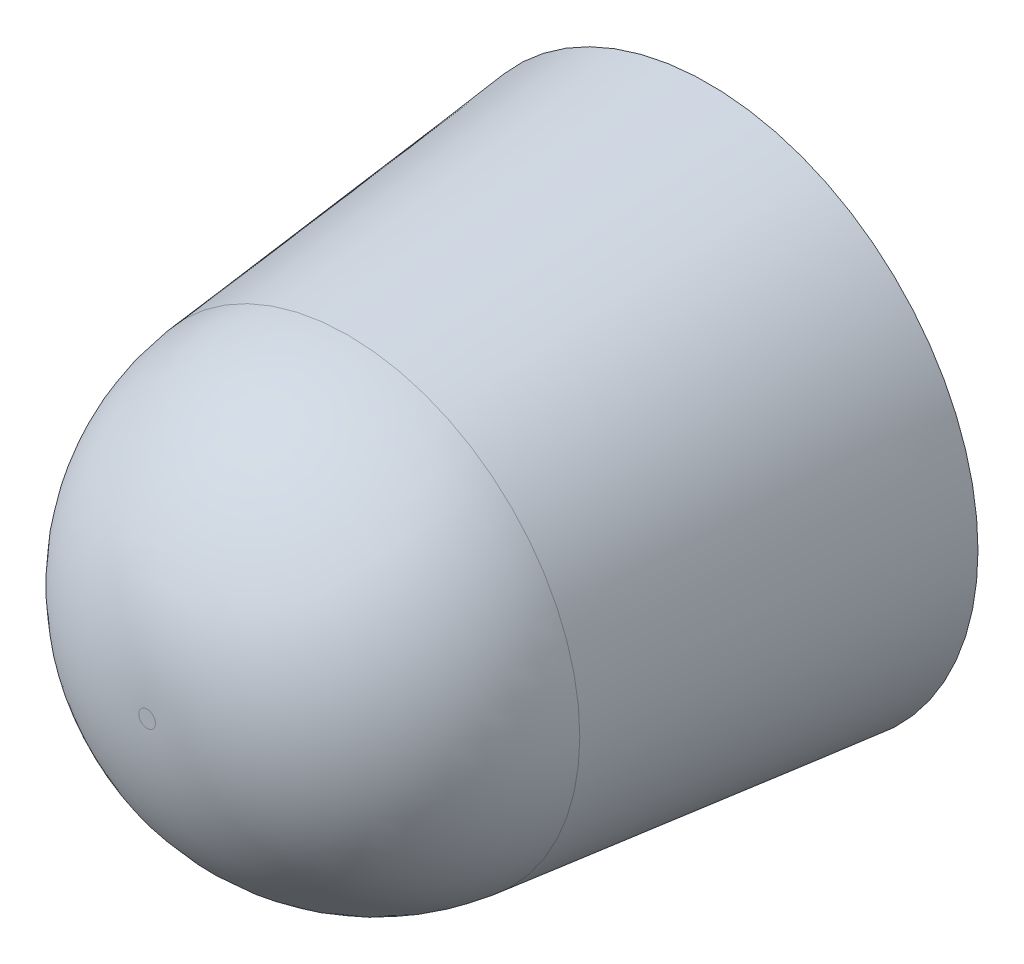
ISO-10303-21;
HEADER;
FILE_DESCRIPTION(('STEP AP214'),'2;1');
FILE_NAME('part.step','',(''),(''),'','','');
FILE_SCHEMA(('AUTOMOTIVE_DESIGN { 1 0 10303 214 1 1 1 1 }'));
ENDSEC;
DATA;
#1=APPLICATION_CONTEXT('core data for automotive mechanical design processes');
#2=APPLICATION_PROTOCOL_DEFINITION('international standard','automotive_design',2000,#1);
#3=PRODUCT_CONTEXT('',#1,'mechanical');
#4=PRODUCT('Part','Part','',(#3));
#5=PRODUCT_RELATED_PRODUCT_CATEGORY('part','',(#4));
#6=PRODUCT_DEFINITION_FORMATION('','',#4);
#7=PRODUCT_DEFINITION_CONTEXT('part definition',#1,'design');
#8=PRODUCT_DEFINITION('design','',#6,#7);
#9=PRODUCT_DEFINITION_SHAPE('','',#8);
#10=(LENGTH_UNIT() NAMED_UNIT(*) SI_UNIT(.MILLI.,.METRE.));
#11=(NAMED_UNIT(*) PLANE_ANGLE_UNIT() SI_UNIT($,.RADIAN.));
#12=(NAMED_UNIT(*) SI_UNIT($,.STERADIAN.) SOLID_ANGLE_UNIT());
#13=UNCERTAINTY_MEASURE_WITH_UNIT(LENGTH_MEASURE(1.E-05),#10,'distance_accuracy_value','');
#14=(GEOMETRIC_REPRESENTATION_CONTEXT(3) GLOBAL_UNCERTAINTY_ASSIGNED_CONTEXT((#13)) GLOBAL_UNIT_ASSIGNED_CONTEXT((#10,
#11,#12)) REPRESENTATION_CONTEXT('',''));
#15=CARTESIAN_POINT('',(0.,0.,0.));
#16=DIRECTION('',(0.,0.,1.));
#17=DIRECTION('',(1.,0.,0.));
#18=AXIS2_PLACEMENT_3D('',#15,#16,#17);
#19=CARTESIAN_POINT('',(0.,0.,200.));
#20=DIRECTION('',(0.,0.,-1.));
#21=DIRECTION('',(1.,0.,0.));
#22=AXIS2_PLACEMENT_3D('',#19,#20,#21);
#23=CONICAL_SURFACE('',#22,75.,0.10471975511966);
#24=CARTESIAN_POINT('',(0.,0.,128.362277061412));
#25=DIRECTION('',(0.,0.,-1.));
#26=DIRECTION('',(-1.,0.,0.));
#27=AXIS2_PLACEMENT_3D('',#24,#25,#26);
#28=CIRCLE('',#27,82.5294280856347);
#29=CARTESIAN_POINT('',(-82.5294280856347,0.,128.362277061412));
#30=VERTEX_POINT('',#29);
#31=EDGE_CURVE('E49',#30,#30,#28,.T.);
#32=ORIENTED_EDGE('',*,*,#31,.T.);
#33=EDGE_LOOP('',(#32));
#34=FACE_BOUND('',#33,.T.);
#35=CARTESIAN_POINT('',(0.,0.,0.));
#36=DIRECTION('',(0.,0.,1.));
#37=DIRECTION('',(1.,0.,0.));
#38=AXIS2_PLACEMENT_3D('',#35,#36,#37);
#39=CIRCLE('',#38,96.0208470531354);
#40=CARTESIAN_POINT('',(96.0208470531354,0.,0.));
#41=VERTEX_POINT('',#40);
#42=EDGE_CURVE('E59',#41,#41,#39,.T.);
#43=ORIENTED_EDGE('',*,*,#42,.T.);
#44=EDGE_LOOP('',(#43));
#45=FACE_BOUND('',#44,.T.);
#46=ADVANCED_FACE('F41',(#34,#45),#23,.T.);
#47=CARTESIAN_POINT('',(0.,0.,200.));
#48=DIRECTION('',(0.,0.,1.));
#49=DIRECTION('',(1.,0.,0.));
#50=AXIS2_PLACEMENT_3D('',#47,#48,#49);
#51=PLANE('',#50);
#52=CARTESIAN_POINT('',(0.,0.,200.));
#53=DIRECTION('',(0.,0.,1.));
#54=DIRECTION('',(1.,0.,0.));
#55=AXIS2_PLACEMENT_3D('',#52,#53,#54);
#56=CIRCLE('',#55,2.96767645617284);
#57=CARTESIAN_POINT('',(2.96767645617284,0.,200.));
#58=VERTEX_POINT('',#57);
#59=EDGE_CURVE('E54',#58,#58,#56,.T.);
#60=ORIENTED_EDGE('',*,*,#59,.T.);
#61=EDGE_LOOP('',(#60));
#62=FACE_BOUND('',#61,.T.);
#63=ADVANCED_FACE('F90',(#62),#51,.T.);
#64=CARTESIAN_POINT('',(0.,0.,120.));
#65=DIRECTION('',(0.,0.,1.));
#66=DIRECTION('',(1.,0.,0.));
#67=AXIS2_PLACEMENT_3D('',#64,#65,#66);
#68=DEGENERATE_TOROIDAL_SURFACE('',#67,2.96767645617284,80.,.T.);
#69=ORIENTED_EDGE('',*,*,#31,.F.);
#70=EDGE_LOOP('',(#69));
#71=FACE_BOUND('',#70,.T.);
#72=ORIENTED_EDGE('',*,*,#59,.F.);
#73=EDGE_LOOP('',(#72));
#74=FACE_BOUND('',#73,.T.);
#75=ADVANCED_FACE('F80',(#71,#74),#68,.T.);
#76=CARTESIAN_POINT('',(0.,0.,198.954715367324));
#77=DIRECTION('',(0.,0.,-1.));
#78=DIRECTION('',(1.,0.,0.));
#79=AXIS2_PLACEMENT_3D('',#76,#77,#78);
#80=CONICAL_SURFACE('',#79,65.0547810463173,0.10471975511966);
#81=CARTESIAN_POINT('',(0.,0.,31.9392750946065));
#82=DIRECTION('',(0.,0.,-1.));
#83=DIRECTION('',(-1.,0.,0.));
#84=AXIS2_PLACEMENT_3D('',#81,#82,#83);
#85=CIRCLE('',#84,82.6088111737415);
#86=CARTESIAN_POINT('',(-82.6088111737415,0.,31.9392750946065));
#87=VERTEX_POINT('',#86);
#88=EDGE_CURVE('E10',#87,#87,#85,.T.);
#89=ORIENTED_EDGE('',*,*,#88,.T.);
#90=EDGE_LOOP('',(#89));
#91=FACE_BOUND('',#90,.T.);
#92=CARTESIAN_POINT('',(0.,0.,127.316992428736));
#93=DIRECTION('',(0.,0.,-1.));
#94=DIRECTION('',(-1.,0.,0.));
#95=AXIS2_PLACEMENT_3D('',#92,#93,#94);
#96=CIRCLE('',#95,72.584209131952);
#97=CARTESIAN_POINT('',(-72.584209131952,0.,127.316992428736));
#98=VERTEX_POINT('',#97);
#99=EDGE_CURVE('E65',#98,#98,#96,.T.);
#100=ORIENTED_EDGE('',*,*,#99,.F.);
#101=EDGE_LOOP('',(#100));
#102=FACE_BOUND('',#101,.T.);
#103=ADVANCED_FACE('F77',(#91,#102),#80,.F.);
#104=CARTESIAN_POINT('',(0.,0.,190.));
#105=DIRECTION('',(0.,0.,1.));
#106=DIRECTION('',(1.,0.,0.));
#107=AXIS2_PLACEMENT_3D('',#104,#105,#106);
#108=PLANE('',#107);
#109=CARTESIAN_POINT('',(0.,0.,190.));
#110=DIRECTION('',(0.,0.,1.));
#111=DIRECTION('',(1.,0.,0.));
#112=AXIS2_PLACEMENT_3D('',#109,#110,#111);
#113=CIRCLE('',#112,2.96767645617285);
#114=CARTESIAN_POINT('',(2.96767645617285,0.,190.));
#115=VERTEX_POINT('',#114);
#116=EDGE_CURVE('E66',#115,#115,#113,.T.);
#117=ORIENTED_EDGE('',*,*,#116,.F.);
#118=EDGE_LOOP('',(#117));
#119=FACE_BOUND('',#118,.T.);
#120=ADVANCED_FACE('F79',(#119),#108,.F.);
#121=CARTESIAN_POINT('',(0.,0.,120.));
#122=DIRECTION('',(0.,0.,1.));
#123=DIRECTION('',(1.,0.,0.));
#124=AXIS2_PLACEMENT_3D('',#121,#122,#123);
#125=DEGENERATE_TOROIDAL_SURFACE('',#124,2.96767645617284,70.,.T.);
#126=ORIENTED_EDGE('',*,*,#99,.T.);
#127=EDGE_LOOP('',(#126));
#128=FACE_BOUND('',#127,.T.);
#129=ORIENTED_EDGE('',*,*,#116,.T.);
#130=EDGE_LOOP('',(#129));
#131=FACE_BOUND('',#130,.T.);
#132=ADVANCED_FACE('F74',(#128,#131),#125,.F.);
#133=CARTESIAN_POINT('',(0.,0.,38.2109828906657));
#134=DIRECTION('',(0.,0.,-1.));
#135=DIRECTION('',(-1.,0.,0.));
#136=AXIS2_PLACEMENT_3D('',#133,#134,#135);
#137=TOROIDAL_SURFACE('',#136,142.280124895838,60.);
#138=ORIENTED_EDGE('',*,*,#88,.F.);
#139=EDGE_LOOP('',(#138));
#140=FACE_BOUND('',#139,.T.);
#141=ORIENTED_EDGE('',*,*,#42,.F.);
#142=EDGE_LOOP('',(#141));
#143=FACE_BOUND('',#142,.T.);
#144=ADVANCED_FACE('F43',(#140,#143),#137,.T.);
#145=CLOSED_SHELL('',(#46,#63,#75,#103,#120,#132,#144));
#146=MANIFOLD_SOLID_BREP('B2',#145);
#147=ADVANCED_BREP_SHAPE_REPRESENTATION('',(#18,#146),#14);
#148=SHAPE_DEFINITION_REPRESENTATION(#9,#147);
ENDSEC;
END-ISO-10303-21;
